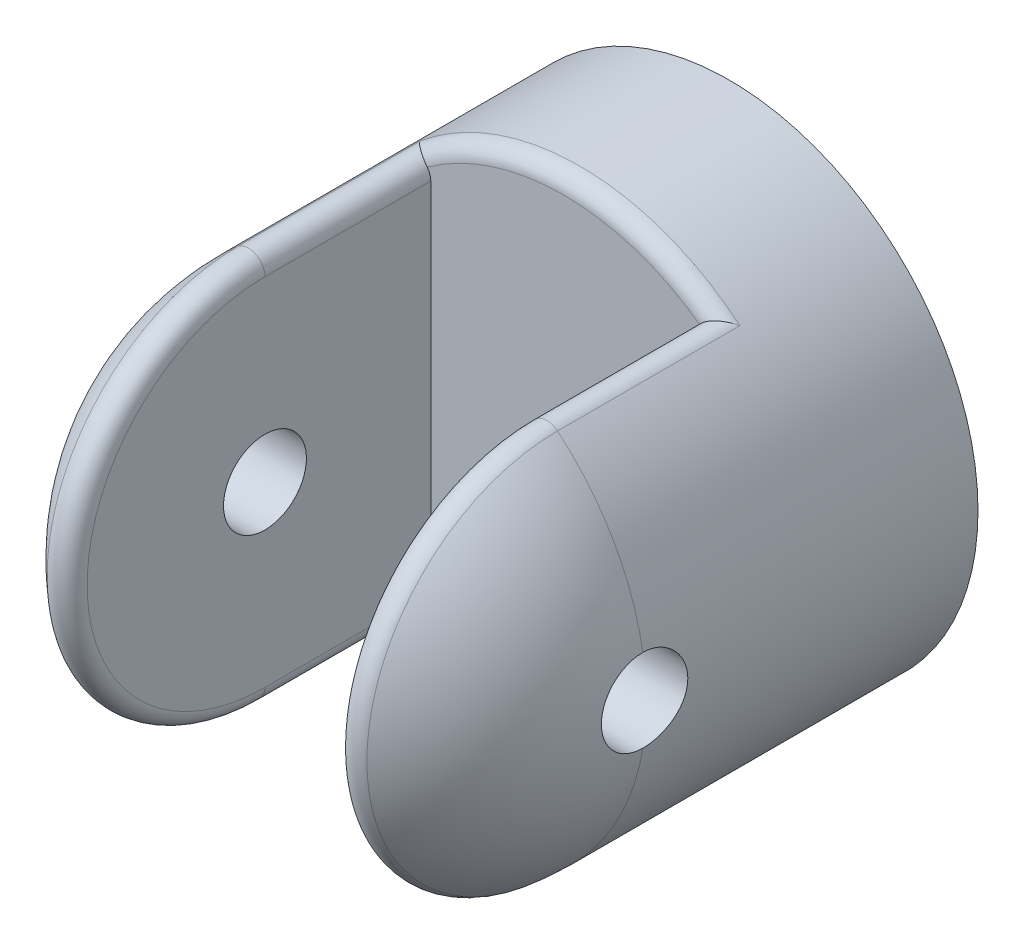
ISO-10303-21;
HEADER;
FILE_DESCRIPTION(('STEP AP214'),'2;1');
FILE_NAME('part.step','',(''),(''),'','','');
FILE_SCHEMA(('AUTOMOTIVE_DESIGN { 1 0 10303 214 1 1 1 1 }'));
ENDSEC;
DATA;
#1=APPLICATION_CONTEXT('core data for automotive mechanical design processes');
#2=APPLICATION_PROTOCOL_DEFINITION('international standard','automotive_design',2000,#1);
#3=PRODUCT_CONTEXT('',#1,'mechanical');
#4=PRODUCT('Part','Part','',(#3));
#5=PRODUCT_RELATED_PRODUCT_CATEGORY('part','',(#4));
#6=PRODUCT_DEFINITION_FORMATION('','',#4);
#7=PRODUCT_DEFINITION_CONTEXT('part definition',#1,'design');
#8=PRODUCT_DEFINITION('design','',#6,#7);
#9=PRODUCT_DEFINITION_SHAPE('','',#8);
#10=(LENGTH_UNIT() NAMED_UNIT(*) SI_UNIT(.MILLI.,.METRE.));
#11=(NAMED_UNIT(*) PLANE_ANGLE_UNIT() SI_UNIT($,.RADIAN.));
#12=(NAMED_UNIT(*) SI_UNIT($,.STERADIAN.) SOLID_ANGLE_UNIT());
#13=UNCERTAINTY_MEASURE_WITH_UNIT(LENGTH_MEASURE(1.E-05),#10,'distance_accuracy_value','');
#14=(GEOMETRIC_REPRESENTATION_CONTEXT(3) GLOBAL_UNCERTAINTY_ASSIGNED_CONTEXT((#13)) GLOBAL_UNIT_ASSIGNED_CONTEXT((#10,
#11,#12)) REPRESENTATION_CONTEXT('',''));
#15=CARTESIAN_POINT('',(0.,0.,0.));
#16=DIRECTION('',(0.,0.,1.));
#17=DIRECTION('',(1.,0.,0.));
#18=AXIS2_PLACEMENT_3D('',#15,#16,#17);
#19=CARTESIAN_POINT('',(0.,0.,10.));
#20=DIRECTION('',(0.,0.,1.));
#21=DIRECTION('',(1.,0.,0.));
#22=AXIS2_PLACEMENT_3D('',#19,#20,#21);
#23=SPHERICAL_SURFACE('',#22,7.5);
#24=CARTESIAN_POINT('',(0.,0.,10.));
#25=DIRECTION('',(0.,0.,1.));
#26=DIRECTION('',(1.,0.,0.));
#27=AXIS2_PLACEMENT_3D('',#24,#25,#26);
#28=CIRCLE('',#27,7.5);
#29=CARTESIAN_POINT('',(7.39509972887452,1.25,10.));
#30=VERTEX_POINT('',#29);
#31=CARTESIAN_POINT('',(4.82142857142857,5.74489569362336,10.));
#32=VERTEX_POINT('',#31);
#33=EDGE_CURVE('E378',#30,#32,#28,.T.);
#34=ORIENTED_EDGE('',*,*,#33,.T.);
#35=CARTESIAN_POINT('',(4.82142857142857,0.,10.));
#36=DIRECTION('',(-1.,0.,0.));
#37=DIRECTION('',(0.,0.,1.));
#38=AXIS2_PLACEMENT_3D('',#35,#36,#37);
#39=CIRCLE('',#38,5.74489569362336);
#40=CARTESIAN_POINT('',(4.82142857142857,-5.74489569362336,10.));
#41=VERTEX_POINT('',#40);
#42=EDGE_CURVE('E335',#32,#41,#39,.F.);
#43=ORIENTED_EDGE('',*,*,#42,.T.);
#44=CARTESIAN_POINT('',(7.39509972887452,-1.25,10.));
#45=VERTEX_POINT('',#44);
#46=EDGE_CURVE('E158',#41,#45,#28,.T.);
#47=ORIENTED_EDGE('',*,*,#46,.T.);
#48=CARTESIAN_POINT('',(7.39509972887452,0.,10.));
#49=DIRECTION('',(-1.,0.,0.));
#50=DIRECTION('',(0.,0.,1.));
#51=AXIS2_PLACEMENT_3D('',#48,#49,#50);
#52=CIRCLE('',#51,1.25);
#53=EDGE_CURVE('E173',#30,#45,#52,.F.);
#54=ORIENTED_EDGE('',*,*,#53,.F.);
#55=EDGE_LOOP('',(#34,#43,#47,#54));
#56=FACE_BOUND('',#55,.T.);
#57=ADVANCED_FACE('F45',(#56),#23,.T.);
#58=CARTESIAN_POINT('',(0.,0.,10.));
#59=DIRECTION('',(0.,0.,-1.));
#60=DIRECTION('',(-1.,0.,0.));
#61=AXIS2_PLACEMENT_3D('',#58,#59,#60);
#62=CYLINDRICAL_SURFACE('',#61,7.5);
#63=ORIENTED_EDGE('',*,*,#46,.F.);
#64=DIRECTION('',(0.,0.,-1.));
#65=VECTOR('',#64,1.);
#66=CARTESIAN_POINT('',(4.82142857142857,-5.74489569362336,10.));
#67=LINE('',#66,#65);
#68=CARTESIAN_POINT('',(4.82142857142857,-5.74489569362336,4.5));
#69=VERTEX_POINT('',#68);
#70=EDGE_CURVE('E306',#41,#69,#67,.T.);
#71=ORIENTED_EDGE('',*,*,#70,.T.);
#72=CARTESIAN_POINT('',(0.,0.,4.5));
#73=DIRECTION('',(0.,0.,-1.));
#74=DIRECTION('',(-1.,0.,0.));
#75=AXIS2_PLACEMENT_3D('',#72,#73,#74);
#76=CIRCLE('',#75,7.5);
#77=CARTESIAN_POINT('',(-4.82142857142857,-5.74489569362336,4.5));
#78=VERTEX_POINT('',#77);
#79=EDGE_CURVE('E300',#69,#78,#76,.T.);
#80=ORIENTED_EDGE('',*,*,#79,.T.);
#81=DIRECTION('',(0.,0.,-1.));
#82=VECTOR('',#81,1.);
#83=CARTESIAN_POINT('',(-4.82142857142857,-5.74489569362336,10.));
#84=LINE('',#83,#82);
#85=CARTESIAN_POINT('',(-4.82142857142857,-5.74489569362336,10.));
#86=VERTEX_POINT('',#85);
#87=EDGE_CURVE('E303',#78,#86,#84,.F.);
#88=ORIENTED_EDGE('',*,*,#87,.T.);
#89=CARTESIAN_POINT('',(-7.39509972887452,-1.25,10.));
#90=VERTEX_POINT('',#89);
#91=EDGE_CURVE('E156',#90,#86,#28,.T.);
#92=ORIENTED_EDGE('',*,*,#91,.F.);
#93=CARTESIAN_POINT('',(-7.39509972887452,-1.25,10.));
#94=CARTESIAN_POINT('',(-7.39509827179246,-1.25000005753556,9.9650928110527));
#95=CARTESIAN_POINT('',(-7.39534720302963,-1.24853686173687,9.93020258818633));
#96=CARTESIAN_POINT('',(-7.39633057516738,-1.24270148667581,9.8606766543903));
#97=CARTESIAN_POINT('',(-7.39706496747142,-1.23832959858466,9.82604091833637));
#98=CARTESIAN_POINT('',(-7.39996932723355,-1.22090187514942,9.72298440741557));
#99=CARTESIAN_POINT('',(-7.40284060734476,-1.20353380373658,9.65526161747966));
#100=CARTESIAN_POINT('',(-7.41012765096964,-1.15781567804882,9.52374591705141));
#101=CARTESIAN_POINT('',(-7.41454375371269,-1.12946321155092,9.45995387333777));
#102=CARTESIAN_POINT('',(-7.42442071847954,-1.06259823670043,9.3380200840865));
#103=CARTESIAN_POINT('',(-7.42988159409678,-1.02408559615255,9.27987841208005));
#104=CARTESIAN_POINT('',(-7.44129207448233,-0.937595765443695,9.17034527555092));
#105=CARTESIAN_POINT('',(-7.44724552254956,-0.889539043971666,9.1190170310419));
#106=CARTESIAN_POINT('',(-7.45893686547244,-0.785491288126569,9.02510759959541));
#107=CARTESIAN_POINT('',(-7.46467472717335,-0.729499039626907,8.98252775359956));
#108=CARTESIAN_POINT('',(-7.47532883659593,-0.610759731508663,8.90709157117773));
#109=CARTESIAN_POINT('',(-7.48023999155071,-0.547974455988943,8.87429460889678));
#110=CARTESIAN_POINT('',(-7.48864388495465,-0.417693962545651,8.8197382391933));
#111=CARTESIAN_POINT('',(-7.4921367962019,-0.350199319583999,8.797977487044));
#112=CARTESIAN_POINT('',(-7.49728364289362,-0.213072677091856,8.76630391627188));
#113=CARTESIAN_POINT('',(-7.4989542261109,-0.143466101292598,8.7562837782925));
#114=CARTESIAN_POINT('',(-7.50032540350412,-0.00353931626425419,8.74804208287004));
#115=CARTESIAN_POINT('',(-7.5000260848567,0.066780861247375,8.74982000331215));
#116=CARTESIAN_POINT('',(-7.49750428817693,0.205401314212721,8.7650406982694));
#117=CARTESIAN_POINT('',(-7.49530090418738,0.273714702876332,8.77836766224837));
#118=CARTESIAN_POINT('',(-7.48923986934197,0.407121405942324,8.81612569819478));
#119=CARTESIAN_POINT('',(-7.48538217865082,0.472214642762168,8.84055703755359));
#120=CARTESIAN_POINT('',(-7.47641340862498,0.597679243262454,8.89994585524146));
#121=CARTESIAN_POINT('',(-7.47129664500616,0.658027507533283,8.9349512395924));
#122=CARTESIAN_POINT('',(-7.46037847450187,0.772034773839589,9.01445814513424));
#123=CARTESIAN_POINT('',(-7.45457703766278,0.825693483003876,9.05896008185658));
#124=CARTESIAN_POINT('',(-7.44285215208957,0.925478700891914,9.15683234077759));
#125=CARTESIAN_POINT('',(-7.43692807481795,0.971506995164296,9.21030276480427));
#126=CARTESIAN_POINT('',(-7.42569127924361,1.05396725542932,9.32427782091681));
#127=CARTESIAN_POINT('',(-7.42037873548972,1.09039648538552,9.38478445147583));
#128=CARTESIAN_POINT('',(-7.4109654061728,1.15264407783289,9.51123680928091));
#129=CARTESIAN_POINT('',(-7.40686668300677,1.17844440956436,9.57719155303115));
#130=CARTESIAN_POINT('',(-7.40037766821894,1.21853592013065,9.71253713391149));
#131=CARTESIAN_POINT('',(-7.39798482294086,1.23284430620161,9.78192266800822));
#132=CARTESIAN_POINT('',(-7.39608901108542,1.24413493023176,9.87652989836086));
#133=CARTESIAN_POINT('',(-7.39571836173485,1.24633524900243,9.90119299018772));
#134=CARTESIAN_POINT('',(-7.39522397012045,1.2492658698301,9.95056712545258));
#135=CARTESIAN_POINT('',(-7.39509981262618,1.24999864407297,9.97527801793764));
#136=CARTESIAN_POINT('',(-7.39509972887452,1.25,10.));
#137=B_SPLINE_CURVE_WITH_KNOTS('',3,(#93,#94,#95,#96,#97,#98,#99,#100,#101,#102,#103,#104,#105,
#106,#107,#108,#109,#110,#111,#112,#113,#114,#115,#116,#117,#118,#119,#120,#121,#122,#123,#124,
#125,#126,#127,#128,#129,#130,#131,#132,#133,#134,#135,#136),.UNSPECIFIED.,.F.,.F.,(4,2,2,2,2,2,
2,2,2,2,2,2,2,2,2,2,2,2,2,2,2,4),(0.,0.104656466266306,0.209302457596598,0.418142199152871,
0.62702782888384,0.835916176586109,1.0466243411297,1.25736477865483,1.46935936547955,
1.68132811523487,1.8913437860973,2.10135016292487,2.30927470838211,2.51720426089053,
2.72609034484371,2.93498557069755,3.14638993574912,3.35785449269842,3.56967631340514,
3.78118037252096,3.85543821232553,3.92957085380307),.UNSPECIFIED.);
#138=CARTESIAN_POINT('',(-7.39509972887452,1.25,10.));
#139=VERTEX_POINT('',#138);
#140=EDGE_CURVE('E161',#90,#139,#137,.T.);
#141=ORIENTED_EDGE('',*,*,#140,.T.);
#142=CARTESIAN_POINT('',(-4.82142857142857,5.74489569362336,10.));
#143=VERTEX_POINT('',#142);
#144=EDGE_CURVE('E143',#143,#139,#28,.T.);
#145=ORIENTED_EDGE('',*,*,#144,.F.);
#146=DIRECTION('',(0.,0.,-1.));
#147=VECTOR('',#146,1.);
#148=CARTESIAN_POINT('',(-4.82142857142857,5.74489569362336,10.));
#149=LINE('',#148,#147);
#150=CARTESIAN_POINT('',(-4.82142857142857,5.74489569362336,4.5));
#151=VERTEX_POINT('',#150);
#152=EDGE_CURVE('E155',#143,#151,#149,.T.);
#153=ORIENTED_EDGE('',*,*,#152,.T.);
#154=CARTESIAN_POINT('',(0.,0.,4.5));
#155=DIRECTION('',(0.,0.,-1.));
#156=DIRECTION('',(-1.,0.,0.));
#157=AXIS2_PLACEMENT_3D('',#154,#155,#156);
#158=CIRCLE('',#157,7.5);
#159=CARTESIAN_POINT('',(4.82142857142857,5.74489569362336,4.5));
#160=VERTEX_POINT('',#159);
#161=EDGE_CURVE('E294',#151,#160,#158,.T.);
#162=ORIENTED_EDGE('',*,*,#161,.T.);
#163=DIRECTION('',(0.,0.,-1.));
#164=VECTOR('',#163,1.);
#165=CARTESIAN_POINT('',(4.82142857142857,5.74489569362336,10.));
#166=LINE('',#165,#164);
#167=EDGE_CURVE('E297',#160,#32,#166,.F.);
#168=ORIENTED_EDGE('',*,*,#167,.T.);
#169=ORIENTED_EDGE('',*,*,#33,.F.);
#170=CARTESIAN_POINT('',(7.39509972887452,1.25,10.));
#171=CARTESIAN_POINT('',(7.39509827179246,1.25000005753556,9.9650928110527));
#172=CARTESIAN_POINT('',(7.39534720302963,1.24853686173687,9.93020258818633));
#173=CARTESIAN_POINT('',(7.39633057516738,1.24270148667581,9.8606766543903));
#174=CARTESIAN_POINT('',(7.39706496747142,1.23832959858466,9.82604091833637));
#175=CARTESIAN_POINT('',(7.39996932723355,1.22090187514942,9.72298440741557));
#176=CARTESIAN_POINT('',(7.40284060734476,1.20353380373658,9.65526161747966));
#177=CARTESIAN_POINT('',(7.41012765096964,1.15781567804882,9.52374591705141));
#178=CARTESIAN_POINT('',(7.41454375371269,1.12946321155092,9.45995387333777));
#179=CARTESIAN_POINT('',(7.42442071847954,1.06259823670043,9.3380200840865));
#180=CARTESIAN_POINT('',(7.42988159409678,1.02408559615255,9.27987841208005));
#181=CARTESIAN_POINT('',(7.44129207448233,0.937595765443695,9.17034527555092));
#182=CARTESIAN_POINT('',(7.44724552254956,0.889539043971666,9.1190170310419));
#183=CARTESIAN_POINT('',(7.45893686547244,0.785491288126569,9.02510759959541));
#184=CARTESIAN_POINT('',(7.46467472717335,0.729499039626907,8.98252775359956));
#185=CARTESIAN_POINT('',(7.47532883659593,0.610759731508663,8.90709157117773));
#186=CARTESIAN_POINT('',(7.48023999155071,0.547974455988943,8.87429460889678));
#187=CARTESIAN_POINT('',(7.48864388495465,0.417693962545651,8.8197382391933));
#188=CARTESIAN_POINT('',(7.4921367962019,0.350199319583999,8.797977487044));
#189=CARTESIAN_POINT('',(7.49728364289362,0.213072677091856,8.76630391627188));
#190=CARTESIAN_POINT('',(7.4989542261109,0.143466101292598,8.7562837782925));
#191=CARTESIAN_POINT('',(7.50032540350412,0.00353931626425419,8.74804208287004));
#192=CARTESIAN_POINT('',(7.5000260848567,-0.066780861247375,8.74982000331215));
#193=CARTESIAN_POINT('',(7.49750428817693,-0.205401314212721,8.7650406982694));
#194=CARTESIAN_POINT('',(7.49530090418738,-0.273714702876332,8.77836766224837));
#195=CARTESIAN_POINT('',(7.48923986934197,-0.407121405942324,8.81612569819478));
#196=CARTESIAN_POINT('',(7.48538217865082,-0.472214642762168,8.84055703755359));
#197=CARTESIAN_POINT('',(7.47641340862498,-0.597679243262454,8.89994585524146));
#198=CARTESIAN_POINT('',(7.47129664500616,-0.658027507533283,8.9349512395924));
#199=CARTESIAN_POINT('',(7.46037847450187,-0.772034773839589,9.01445814513424));
#200=CARTESIAN_POINT('',(7.45457703766278,-0.825693483003876,9.05896008185658));
#201=CARTESIAN_POINT('',(7.44285215208957,-0.925478700891914,9.15683234077759));
#202=CARTESIAN_POINT('',(7.43692807481795,-0.971506995164296,9.21030276480427));
#203=CARTESIAN_POINT('',(7.42569127924361,-1.05396725542932,9.32427782091681));
#204=CARTESIAN_POINT('',(7.42037873548972,-1.09039648538552,9.38478445147583));
#205=CARTESIAN_POINT('',(7.4109654061728,-1.15264407783289,9.51123680928091));
#206=CARTESIAN_POINT('',(7.40686668300677,-1.17844440956436,9.57719155303115));
#207=CARTESIAN_POINT('',(7.40037766821894,-1.21853592013065,9.71253713391149));
#208=CARTESIAN_POINT('',(7.39798482294086,-1.23284430620161,9.78192266800822));
#209=CARTESIAN_POINT('',(7.39608901108542,-1.24413493023176,9.87652989836086));
#210=CARTESIAN_POINT('',(7.39571836173485,-1.24633524900243,9.90119299018772));
#211=CARTESIAN_POINT('',(7.39522397012045,-1.2492658698301,9.95056712545258));
#212=CARTESIAN_POINT('',(7.39509981262618,-1.24999864407297,9.97527801793764));
#213=CARTESIAN_POINT('',(7.39509972887452,-1.25,10.));
#214=B_SPLINE_CURVE_WITH_KNOTS('',3,(#170,#171,#172,#173,#174,#175,#176,#177,#178,#179,#180,
#181,#182,#183,#184,#185,#186,#187,#188,#189,#190,#191,#192,#193,#194,#195,#196,#197,#198,#199,
#200,#201,#202,#203,#204,#205,#206,#207,#208,#209,#210,#211,#212,#213),.UNSPECIFIED.,.F.,.F.,(4,
2,2,2,2,2,2,2,2,2,2,2,2,2,2,2,2,2,2,2,2,4),(0.,0.104656466266306,0.209302457596598,
0.418142199152871,0.62702782888384,0.835916176586109,1.0466243411297,1.25736477865483,
1.46935936547955,1.68132811523487,1.8913437860973,2.10135016292487,2.30927470838211,
2.51720426089053,2.72609034484371,2.93498557069755,3.14638993574912,3.35785449269842,
3.56967631340514,3.78118037252096,3.85543821232553,3.92957085380307),.UNSPECIFIED.);
#215=EDGE_CURVE('E169',#30,#45,#214,.T.);
#216=ORIENTED_EDGE('',*,*,#215,.T.);
#217=EDGE_LOOP('',(#63,#71,#80,#88,#92,#141,#145,#153,#162,#168,#169,#216));
#218=FACE_BOUND('',#217,.T.);
#219=CARTESIAN_POINT('',(0.,0.,0.));
#220=DIRECTION('',(0.,0.,1.));
#221=DIRECTION('',(1.,0.,0.));
#222=AXIS2_PLACEMENT_3D('',#219,#220,#221);
#223=CIRCLE('',#222,7.5);
#224=CARTESIAN_POINT('',(7.5,0.,0.));
#225=VERTEX_POINT('',#224);
#226=EDGE_CURVE('E380',#225,#225,#223,.T.);
#227=ORIENTED_EDGE('',*,*,#226,.T.);
#228=EDGE_LOOP('',(#227));
#229=FACE_BOUND('',#228,.T.);
#230=ADVANCED_FACE('F166',(#218,#229),#62,.T.);
#231=ORIENTED_EDGE('',*,*,#91,.T.);
#232=CARTESIAN_POINT('',(-4.82142857142857,0.,10.));
#233=DIRECTION('',(1.,0.,0.));
#234=DIRECTION('',(0.,0.,-1.));
#235=AXIS2_PLACEMENT_3D('',#232,#233,#234);
#236=CIRCLE('',#235,5.74489569362336);
#237=EDGE_CURVE('E150',#86,#143,#236,.F.);
#238=ORIENTED_EDGE('',*,*,#237,.T.);
#239=ORIENTED_EDGE('',*,*,#144,.T.);
#240=CARTESIAN_POINT('',(-7.39509972887452,0.,10.));
#241=DIRECTION('',(1.,0.,0.));
#242=DIRECTION('',(0.,0.,-1.));
#243=AXIS2_PLACEMENT_3D('',#240,#241,#242);
#244=CIRCLE('',#243,1.25);
#245=EDGE_CURVE('E147',#90,#139,#244,.F.);
#246=ORIENTED_EDGE('',*,*,#245,.F.);
#247=EDGE_LOOP('',(#231,#238,#239,#246));
#248=FACE_BOUND('',#247,.T.);
#249=ADVANCED_FACE('F146',(#248),#23,.T.);
#250=CARTESIAN_POINT('',(0.,0.,0.));
#251=DIRECTION('',(0.,0.,1.));
#252=DIRECTION('',(1.,0.,0.));
#253=AXIS2_PLACEMENT_3D('',#250,#251,#252);
#254=PLANE('',#253);
#255=ORIENTED_EDGE('',*,*,#226,.F.);
#256=EDGE_LOOP('',(#255));
#257=FACE_BOUND('',#256,.T.);
#258=ADVANCED_FACE('F201',(#257),#254,.F.);
#259=CARTESIAN_POINT('',(-4.,-19.,5.));
#260=DIRECTION('',(0.,0.,-1.));
#261=DIRECTION('',(-1.,0.,0.));
#262=AXIS2_PLACEMENT_3D('',#259,#260,#261);
#263=PLANE('',#262);
#264=CARTESIAN_POINT('',(-4.5,-5.3619026473818,5.));
#265=DIRECTION('',(0.,0.,-1.));
#266=DIRECTION('',(-1.,0.,0.));
#267=AXIS2_PLACEMENT_3D('',#264,#265,#266);
#268=CIRCLE('',#267,0.5);
#269=CARTESIAN_POINT('',(-4.,-5.3619026473818,5.));
#270=VERTEX_POINT('',#269);
#271=CARTESIAN_POINT('',(-4.10577169562848,-5.66944783760977,5.));
#272=VERTEX_POINT('',#271);
#273=EDGE_CURVE('E61',#270,#272,#268,.T.);
#274=ORIENTED_EDGE('',*,*,#273,.T.);
#275=CARTESIAN_POINT('',(0.,0.,5.));
#276=DIRECTION('',(0.,0.,-1.));
#277=DIRECTION('',(-1.,0.,0.));
#278=AXIS2_PLACEMENT_3D('',#275,#276,#277);
#279=CIRCLE('',#278,7.);
#280=CARTESIAN_POINT('',(4.10577169562848,-5.66944783760977,5.));
#281=VERTEX_POINT('',#280);
#282=EDGE_CURVE('E76',#272,#281,#279,.F.);
#283=ORIENTED_EDGE('',*,*,#282,.T.);
#284=CARTESIAN_POINT('',(4.5,-5.3619026473818,5.));
#285=DIRECTION('',(0.,0.,-1.));
#286=DIRECTION('',(-1.,0.,0.));
#287=AXIS2_PLACEMENT_3D('',#284,#285,#286);
#288=CIRCLE('',#287,0.5);
#289=CARTESIAN_POINT('',(4.,-5.3619026473818,5.));
#290=VERTEX_POINT('',#289);
#291=EDGE_CURVE('E338',#281,#290,#288,.T.);
#292=ORIENTED_EDGE('',*,*,#291,.T.);
#293=DIRECTION('',(0.,1.,0.));
#294=VECTOR('',#293,1.);
#295=CARTESIAN_POINT('',(4.,-19.,5.));
#296=LINE('',#295,#294);
#297=CARTESIAN_POINT('',(4.,5.3619026473818,5.));
#298=VERTEX_POINT('',#297);
#299=EDGE_CURVE('E386',#290,#298,#296,.T.);
#300=ORIENTED_EDGE('',*,*,#299,.T.);
#301=CARTESIAN_POINT('',(4.5,5.3619026473818,5.));
#302=DIRECTION('',(0.,0.,-1.));
#303=DIRECTION('',(-1.,0.,0.));
#304=AXIS2_PLACEMENT_3D('',#301,#302,#303);
#305=CIRCLE('',#304,0.5);
#306=CARTESIAN_POINT('',(4.10577169562848,5.66944783760977,5.));
#307=VERTEX_POINT('',#306);
#308=EDGE_CURVE('E341',#298,#307,#305,.T.);
#309=ORIENTED_EDGE('',*,*,#308,.T.);
#310=CARTESIAN_POINT('',(0.,0.,5.));
#311=DIRECTION('',(0.,0.,-1.));
#312=DIRECTION('',(-1.,0.,0.));
#313=AXIS2_PLACEMENT_3D('',#310,#311,#312);
#314=CIRCLE('',#313,7.);
#315=CARTESIAN_POINT('',(-4.10577169562848,5.66944783760977,5.));
#316=VERTEX_POINT('',#315);
#317=EDGE_CURVE('E68',#307,#316,#314,.F.);
#318=ORIENTED_EDGE('',*,*,#317,.T.);
#319=CARTESIAN_POINT('',(-4.5,5.3619026473818,5.));
#320=DIRECTION('',(0.,0.,-1.));
#321=DIRECTION('',(-1.,0.,0.));
#322=AXIS2_PLACEMENT_3D('',#319,#320,#321);
#323=CIRCLE('',#322,0.5);
#324=CARTESIAN_POINT('',(-4.,5.3619026473818,5.));
#325=VERTEX_POINT('',#324);
#326=EDGE_CURVE('E11',#316,#325,#323,.T.);
#327=ORIENTED_EDGE('',*,*,#326,.T.);
#328=DIRECTION('',(0.,1.,0.));
#329=VECTOR('',#328,1.);
#330=CARTESIAN_POINT('',(-4.,-19.,5.));
#331=LINE('',#330,#329);
#332=EDGE_CURVE('E349',#270,#325,#331,.T.);
#333=ORIENTED_EDGE('',*,*,#332,.F.);
#334=EDGE_LOOP('',(#274,#283,#292,#300,#309,#318,#327,#333));
#335=FACE_BOUND('',#334,.T.);
#336=ADVANCED_FACE('F196',(#335),#263,.F.);
#337=CARTESIAN_POINT('',(4.,-19.,9.5));
#338=DIRECTION('',(1.,0.,0.));
#339=DIRECTION('',(0.,0.,-1.));
#340=AXIS2_PLACEMENT_3D('',#337,#338,#339);
#341=PLANE('',#340);
#342=ORIENTED_EDGE('',*,*,#299,.F.);
#343=DIRECTION('',(0.,0.,-1.));
#344=VECTOR('',#343,1.);
#345=CARTESIAN_POINT('',(4.,-5.3619026473818,9.5));
#346=LINE('',#345,#344);
#347=CARTESIAN_POINT('',(4.,-5.3619026473818,10.));
#348=VERTEX_POINT('',#347);
#349=EDGE_CURVE('E316',#290,#348,#346,.F.);
#350=ORIENTED_EDGE('',*,*,#349,.T.);
#351=CARTESIAN_POINT('',(4.,0.,10.));
#352=DIRECTION('',(1.,0.,0.));
#353=DIRECTION('',(0.,0.,-1.));
#354=AXIS2_PLACEMENT_3D('',#351,#352,#353);
#355=CIRCLE('',#354,5.3619026473818);
#356=CARTESIAN_POINT('',(4.,5.3619026473818,10.));
#357=VERTEX_POINT('',#356);
#358=EDGE_CURVE('E310',#348,#357,#355,.F.);
#359=ORIENTED_EDGE('',*,*,#358,.T.);
#360=DIRECTION('',(0.,0.,-1.));
#361=VECTOR('',#360,1.);
#362=CARTESIAN_POINT('',(4.,5.3619026473818,9.5));
#363=LINE('',#362,#361);
#364=EDGE_CURVE('E313',#357,#298,#363,.T.);
#365=ORIENTED_EDGE('',*,*,#364,.T.);
#366=EDGE_LOOP('',(#342,#350,#359,#365));
#367=FACE_BOUND('',#366,.T.);
#368=CARTESIAN_POINT('',(4.,0.,10.));
#369=DIRECTION('',(1.,0.,0.));
#370=DIRECTION('',(0.,0.,-1.));
#371=AXIS2_PLACEMENT_3D('',#368,#369,#370);
#372=CIRCLE('',#371,1.25);
#373=CARTESIAN_POINT('',(4.,0.,8.75));
#374=VERTEX_POINT('',#373);
#375=EDGE_CURVE('E163',#374,#374,#372,.T.);
#376=ORIENTED_EDGE('',*,*,#375,.T.);
#377=EDGE_LOOP('',(#376));
#378=FACE_BOUND('',#377,.T.);
#379=ADVANCED_FACE('F200',(#367,#378),#341,.F.);
#380=CARTESIAN_POINT('',(-4.,-19.,10.));
#381=DIRECTION('',(-1.,0.,0.));
#382=DIRECTION('',(0.,0.,1.));
#383=AXIS2_PLACEMENT_3D('',#380,#381,#382);
#384=PLANE('',#383);
#385=CARTESIAN_POINT('',(-4.,0.,10.));
#386=DIRECTION('',(-1.,0.,0.));
#387=DIRECTION('',(0.,0.,1.));
#388=AXIS2_PLACEMENT_3D('',#385,#386,#387);
#389=CIRCLE('',#388,1.25);
#390=CARTESIAN_POINT('',(-4.,0.,11.25));
#391=VERTEX_POINT('',#390);
#392=EDGE_CURVE('E280',#391,#391,#389,.T.);
#393=ORIENTED_EDGE('',*,*,#392,.T.);
#394=EDGE_LOOP('',(#393));
#395=FACE_BOUND('',#394,.T.);
#396=CARTESIAN_POINT('',(-4.,0.,10.));
#397=DIRECTION('',(-1.,0.,0.));
#398=DIRECTION('',(0.,0.,1.));
#399=AXIS2_PLACEMENT_3D('',#396,#397,#398);
#400=CIRCLE('',#399,5.3619026473818);
#401=CARTESIAN_POINT('',(-4.,5.3619026473818,10.));
#402=VERTEX_POINT('',#401);
#403=CARTESIAN_POINT('',(-4.,-5.3619026473818,10.));
#404=VERTEX_POINT('',#403);
#405=EDGE_CURVE('E323',#402,#404,#400,.F.);
#406=ORIENTED_EDGE('',*,*,#405,.T.);
#407=DIRECTION('',(0.,0.,-1.));
#408=VECTOR('',#407,1.);
#409=CARTESIAN_POINT('',(-4.,-5.3619026473818,10.));
#410=LINE('',#409,#408);
#411=EDGE_CURVE('E326',#404,#270,#410,.T.);
#412=ORIENTED_EDGE('',*,*,#411,.T.);
#413=ORIENTED_EDGE('',*,*,#332,.T.);
#414=DIRECTION('',(0.,0.,-1.));
#415=VECTOR('',#414,1.);
#416=CARTESIAN_POINT('',(-4.,5.3619026473818,10.));
#417=LINE('',#416,#415);
#418=EDGE_CURVE('E320',#325,#402,#417,.F.);
#419=ORIENTED_EDGE('',*,*,#418,.T.);
#420=EDGE_LOOP('',(#406,#412,#413,#419));
#421=FACE_BOUND('',#420,.T.);
#422=ADVANCED_FACE('F194',(#395,#421),#384,.F.);
#423=CARTESIAN_POINT('',(-19.,0.,10.));
#424=DIRECTION('',(1.,0.,0.));
#425=DIRECTION('',(0.,0.,-1.));
#426=AXIS2_PLACEMENT_3D('',#423,#424,#425);
#427=CYLINDRICAL_SURFACE('',#426,1.25);
#428=ORIENTED_EDGE('',*,*,#392,.F.);
#429=EDGE_LOOP('',(#428));
#430=FACE_BOUND('',#429,.T.);
#431=ORIENTED_EDGE('',*,*,#245,.T.);
#432=ORIENTED_EDGE('',*,*,#140,.F.);
#433=EDGE_LOOP('',(#431,#432));
#434=FACE_BOUND('',#433,.T.);
#435=ADVANCED_FACE('F160',(#430,#434),#427,.F.);
#436=ORIENTED_EDGE('',*,*,#53,.T.);
#437=ORIENTED_EDGE('',*,*,#215,.F.);
#438=EDGE_LOOP('',(#436,#437));
#439=FACE_BOUND('',#438,.T.);
#440=ORIENTED_EDGE('',*,*,#375,.F.);
#441=EDGE_LOOP('',(#440));
#442=FACE_BOUND('',#441,.T.);
#443=ADVANCED_FACE('F193',(#439,#442),#427,.F.);
#444=CARTESIAN_POINT('',(-4.5,5.3619026473818,10.));
#445=DIRECTION('',(0.,0.,-1.));
#446=DIRECTION('',(-1.,0.,0.));
#447=AXIS2_PLACEMENT_3D('',#444,#445,#446);
#448=CYLINDRICAL_SURFACE('',#447,0.5);
#449=ORIENTED_EDGE('',*,*,#418,.F.);
#450=ORIENTED_EDGE('',*,*,#326,.F.);
#451=CARTESIAN_POINT('',(-4.10577169562848,5.66944783760977,5.));
#452=CARTESIAN_POINT('',(-4.119661903776,5.68731388254085,5.00003535227214));
#453=CARTESIAN_POINT('',(-4.13478199335128,5.70414137805357,4.99846793199711));
#454=CARTESIAN_POINT('',(-4.16670074633458,5.73525727758441,4.99249196224239));
#455=CARTESIAN_POINT('',(-4.18348358815651,5.74956658307036,4.98810835785598));
#456=CARTESIAN_POINT('',(-4.21815935906617,5.77546827858084,4.97687008712724));
#457=CARTESIAN_POINT('',(-4.23604878259789,5.78706874324045,4.97002292342635));
#458=CARTESIAN_POINT('',(-4.27247149887798,5.80762557374303,4.95428403946822));
#459=CARTESIAN_POINT('',(-4.2910062021158,5.81657568024738,4.9453875660063));
#460=CARTESIAN_POINT('',(-4.33583315753335,5.83503242420134,4.92201863140045));
#461=CARTESIAN_POINT('',(-4.36222257198922,5.84329227635379,4.90674814998822));
#462=CARTESIAN_POINT('',(-4.41458878793545,5.85528829489305,4.87391547047696));
#463=CARTESIAN_POINT('',(-4.44056478109659,5.85901647052598,4.85634928454718));
#464=CARTESIAN_POINT('',(-4.50070989120355,5.86310456745744,4.81306056312297));
#465=CARTESIAN_POINT('',(-4.53450324823681,5.86179265149161,4.78666081208492));
#466=CARTESIAN_POINT('',(-4.59971539751038,5.85296438757054,4.73205275786872));
#467=CARTESIAN_POINT('',(-4.63113109259798,5.84544009418895,4.70384218133997));
#468=CARTESIAN_POINT('',(-4.69039251556763,5.82526707268268,4.64707859410685));
#469=CARTESIAN_POINT('',(-4.71830556408485,5.81274496643499,4.61854983549287));
#470=CARTESIAN_POINT('',(-4.77101360482819,5.7831651150059,4.56107707877253));
#471=CARTESIAN_POINT('',(-4.79581521671192,5.7661172480243,4.53213411336249));
#472=CARTESIAN_POINT('',(-4.81972613125751,5.7463196470785,4.5021441867674));
#473=CARTESIAN_POINT('',(-4.82057855670768,5.74560906790061,4.50107206936992));
#474=CARTESIAN_POINT('',(-4.82142857142857,5.74489569362336,4.5));
#475=B_SPLINE_CURVE_WITH_KNOTS('',3,(#451,#452,#453,#454,#455,#456,#457,#458,#459,#460,#461,
#462,#463,#464,#465,#466,#467,#468,#469,#470,#471,#472,#473,#474),.UNSPECIFIED.,.F.,.F.,(4,2,2,
2,2,2,2,2,2,2,2,4),(0.,0.0676845841263272,0.134777749096304,0.201668291254784,0.268715571155792,
0.362958428476518,0.457367225287674,0.585389388734371,0.713575542415653,0.838701554799065,
0.963556673520436,0.968185787288805),.UNSPECIFIED.);
#476=EDGE_CURVE('E50',#151,#316,#475,.F.);
#477=ORIENTED_EDGE('',*,*,#476,.F.);
#478=ORIENTED_EDGE('',*,*,#152,.F.);
#479=CARTESIAN_POINT('',(-4.5,5.3619026473818,10.));
#480=DIRECTION('',(0.,0.,1.));
#481=DIRECTION('',(1.,0.,0.));
#482=AXIS2_PLACEMENT_3D('',#479,#480,#481);
#483=CIRCLE('',#482,0.5);
#484=EDGE_CURVE('E271',#402,#143,#483,.T.);
#485=ORIENTED_EDGE('',*,*,#484,.F.);
#486=EDGE_LOOP('',(#449,#450,#477,#478,#485));
#487=FACE_BOUND('',#486,.T.);
#488=ADVANCED_FACE('F47',(#487),#448,.T.);
#489=CARTESIAN_POINT('',(0.,0.,4.5));
#490=DIRECTION('',(0.,0.,-1.));
#491=DIRECTION('',(-1.,0.,0.));
#492=AXIS2_PLACEMENT_3D('',#489,#490,#491);
#493=TOROIDAL_SURFACE('',#492,7.,0.5);
#494=ORIENTED_EDGE('',*,*,#317,.F.);
#495=CARTESIAN_POINT('',(4.10577169562848,5.66944783760977,5.));
#496=CARTESIAN_POINT('',(4.119661903776,5.68731388254085,5.00003535227214));
#497=CARTESIAN_POINT('',(4.13478199335128,5.70414137805357,4.99846793199711));
#498=CARTESIAN_POINT('',(4.16670074633458,5.73525727758441,4.99249196224239));
#499=CARTESIAN_POINT('',(4.18348358815651,5.74956658307036,4.98810835785598));
#500=CARTESIAN_POINT('',(4.21815935906617,5.77546827858084,4.97687008712724));
#501=CARTESIAN_POINT('',(4.23604878259789,5.78706874324045,4.97002292342635));
#502=CARTESIAN_POINT('',(4.27247149887798,5.80762557374303,4.95428403946822));
#503=CARTESIAN_POINT('',(4.2910062021158,5.81657568024738,4.9453875660063));
#504=CARTESIAN_POINT('',(4.33583315753335,5.83503242420134,4.92201863140045));
#505=CARTESIAN_POINT('',(4.36222257198922,5.84329227635379,4.90674814998822));
#506=CARTESIAN_POINT('',(4.41458878793545,5.85528829489305,4.87391547047696));
#507=CARTESIAN_POINT('',(4.44056478109659,5.85901647052598,4.85634928454718));
#508=CARTESIAN_POINT('',(4.50070989120355,5.86310456745744,4.81306056312297));
#509=CARTESIAN_POINT('',(4.53450324823681,5.86179265149161,4.78666081208492));
#510=CARTESIAN_POINT('',(4.59971539751038,5.85296438757054,4.73205275786872));
#511=CARTESIAN_POINT('',(4.63113109259798,5.84544009418895,4.70384218133997));
#512=CARTESIAN_POINT('',(4.69039251556763,5.82526707268268,4.64707859410685));
#513=CARTESIAN_POINT('',(4.71830556408485,5.81274496643499,4.61854983549287));
#514=CARTESIAN_POINT('',(4.77101360482819,5.7831651150059,4.56107707877253));
#515=CARTESIAN_POINT('',(4.79581521671192,5.7661172480243,4.53213411336249));
#516=CARTESIAN_POINT('',(4.81972613125751,5.7463196470785,4.5021441867674));
#517=CARTESIAN_POINT('',(4.82057855670768,5.74560906790061,4.50107206936992));
#518=CARTESIAN_POINT('',(4.82142857142857,5.74489569362336,4.5));
#519=B_SPLINE_CURVE_WITH_KNOTS('',3,(#495,#496,#497,#498,#499,#500,#501,#502,#503,#504,#505,
#506,#507,#508,#509,#510,#511,#512,#513,#514,#515,#516,#517,#518),.UNSPECIFIED.,.F.,.F.,(4,2,2,
2,2,2,2,2,2,2,2,4),(0.,0.0676845841263272,0.134777749096304,0.201668291254784,0.268715571155792,
0.362958428476518,0.457367225287674,0.585389388734371,0.713575542415653,0.838701554799065,
0.963556673520436,0.968185787288805),.UNSPECIFIED.);
#520=EDGE_CURVE('E264',#160,#307,#519,.F.);
#521=ORIENTED_EDGE('',*,*,#520,.F.);
#522=ORIENTED_EDGE('',*,*,#161,.F.);
#523=ORIENTED_EDGE('',*,*,#476,.T.);
#524=EDGE_LOOP('',(#494,#521,#522,#523));
#525=FACE_BOUND('',#524,.T.);
#526=ADVANCED_FACE('F261',(#525),#493,.T.);
#527=CARTESIAN_POINT('',(-4.5,0.,10.));
#528=DIRECTION('',(-1.,0.,0.));
#529=DIRECTION('',(0.,0.,1.));
#530=AXIS2_PLACEMENT_3D('',#527,#528,#529);
#531=TOROIDAL_SURFACE('',#530,5.3619026473818,0.5);
#532=ORIENTED_EDGE('',*,*,#484,.T.);
#533=ORIENTED_EDGE('',*,*,#237,.F.);
#534=CARTESIAN_POINT('',(-4.5,-5.3619026473818,10.));
#535=DIRECTION('',(0.,0.,-1.));
#536=DIRECTION('',(-1.,0.,0.));
#537=AXIS2_PLACEMENT_3D('',#534,#535,#536);
#538=CIRCLE('',#537,0.5);
#539=EDGE_CURVE('E272',#404,#86,#538,.T.);
#540=ORIENTED_EDGE('',*,*,#539,.F.);
#541=ORIENTED_EDGE('',*,*,#405,.F.);
#542=EDGE_LOOP('',(#532,#533,#540,#541));
#543=FACE_BOUND('',#542,.T.);
#544=ADVANCED_FACE('F259',(#543),#531,.T.);
#545=CARTESIAN_POINT('',(4.5,5.3619026473818,10.));
#546=DIRECTION('',(0.,0.,-1.));
#547=DIRECTION('',(-1.,0.,0.));
#548=AXIS2_PLACEMENT_3D('',#545,#546,#547);
#549=CYLINDRICAL_SURFACE('',#548,0.5);
#550=ORIENTED_EDGE('',*,*,#308,.F.);
#551=ORIENTED_EDGE('',*,*,#364,.F.);
#552=CARTESIAN_POINT('',(4.5,5.3619026473818,10.));
#553=DIRECTION('',(0.,0.,1.));
#554=DIRECTION('',(1.,0.,0.));
#555=AXIS2_PLACEMENT_3D('',#552,#553,#554);
#556=CIRCLE('',#555,0.5);
#557=EDGE_CURVE('E245',#32,#357,#556,.T.);
#558=ORIENTED_EDGE('',*,*,#557,.F.);
#559=ORIENTED_EDGE('',*,*,#167,.F.);
#560=ORIENTED_EDGE('',*,*,#520,.T.);
#561=EDGE_LOOP('',(#550,#551,#558,#559,#560));
#562=FACE_BOUND('',#561,.T.);
#563=ADVANCED_FACE('F252',(#562),#549,.T.);
#564=CARTESIAN_POINT('',(-4.5,-5.3619026473818,10.));
#565=DIRECTION('',(0.,0.,-1.));
#566=DIRECTION('',(-1.,0.,0.));
#567=AXIS2_PLACEMENT_3D('',#564,#565,#566);
#568=CYLINDRICAL_SURFACE('',#567,0.5);
#569=ORIENTED_EDGE('',*,*,#539,.T.);
#570=ORIENTED_EDGE('',*,*,#87,.F.);
#571=CARTESIAN_POINT('',(-4.10577169562848,-5.66944783760977,5.));
#572=CARTESIAN_POINT('',(-4.119661903776,-5.68731388254085,5.00003535227214));
#573=CARTESIAN_POINT('',(-4.13478199335128,-5.70414137805356,4.99846793199711));
#574=CARTESIAN_POINT('',(-4.16670074633458,-5.73525727758441,4.99249196224239));
#575=CARTESIAN_POINT('',(-4.18348358815651,-5.74956658307036,4.98810835785598));
#576=CARTESIAN_POINT('',(-4.21815935906617,-5.77546827858084,4.97687008712724));
#577=CARTESIAN_POINT('',(-4.23604878259789,-5.78706874324045,4.97002292342635));
#578=CARTESIAN_POINT('',(-4.27247149887798,-5.80762557374303,4.95428403946822));
#579=CARTESIAN_POINT('',(-4.2910062021158,-5.81657568024738,4.9453875660063));
#580=CARTESIAN_POINT('',(-4.33583315753334,-5.83503242420134,4.92201863140045));
#581=CARTESIAN_POINT('',(-4.36222257198921,-5.84329227635379,4.90674814998822));
#582=CARTESIAN_POINT('',(-4.41458878793544,-5.85528829489305,4.87391547047696));
#583=CARTESIAN_POINT('',(-4.44056478109659,-5.85901647052598,4.85634928454718));
#584=CARTESIAN_POINT('',(-4.50070989120355,-5.86310456745744,4.81306056312298));
#585=CARTESIAN_POINT('',(-4.5345032482368,-5.86179265149161,4.78666081208492));
#586=CARTESIAN_POINT('',(-4.59971539751037,-5.85296438757054,4.73205275786872));
#587=CARTESIAN_POINT('',(-4.63113109259797,-5.84544009418895,4.70384218133998));
#588=CARTESIAN_POINT('',(-4.69039251556762,-5.82526707268268,4.64707859410686));
#589=CARTESIAN_POINT('',(-4.71830556408485,-5.812744966435,4.61854983549287));
#590=CARTESIAN_POINT('',(-4.77101360482819,-5.7831651150059,4.56107707877253));
#591=CARTESIAN_POINT('',(-4.79581521671192,-5.7661172480243,4.53213411336249));
#592=CARTESIAN_POINT('',(-4.81972613125751,-5.7463196470785,4.5021441867674));
#593=CARTESIAN_POINT('',(-4.82057855670768,-5.74560906790061,4.50107206936992));
#594=CARTESIAN_POINT('',(-4.82142857142857,-5.74489569362336,4.5));
#595=B_SPLINE_CURVE_WITH_KNOTS('',3,(#571,#572,#573,#574,#575,#576,#577,#578,#579,#580,#581,
#582,#583,#584,#585,#586,#587,#588,#589,#590,#591,#592,#593,#594),.UNSPECIFIED.,.F.,.F.,(4,2,2,
2,2,2,2,2,2,2,2,4),(0.,0.0676845841263272,0.134777749096303,0.201668291254782,0.26871557115579,
0.362958428476515,0.457367225287669,0.585389388734365,0.713575542415645,0.838701554799062,
0.963556673520437,0.968185787288806),.UNSPECIFIED.);
#596=EDGE_CURVE('E238',#272,#78,#595,.T.);
#597=ORIENTED_EDGE('',*,*,#596,.F.);
#598=ORIENTED_EDGE('',*,*,#273,.F.);
#599=ORIENTED_EDGE('',*,*,#411,.F.);
#600=EDGE_LOOP('',(#569,#570,#597,#598,#599));
#601=FACE_BOUND('',#600,.T.);
#602=ADVANCED_FACE('F248',(#601),#568,.T.);
#603=CARTESIAN_POINT('',(4.5,0.,10.));
#604=DIRECTION('',(1.,0.,0.));
#605=DIRECTION('',(0.,0.,-1.));
#606=AXIS2_PLACEMENT_3D('',#603,#604,#605);
#607=TOROIDAL_SURFACE('',#606,5.3619026473818,0.5);
#608=ORIENTED_EDGE('',*,*,#557,.T.);
#609=ORIENTED_EDGE('',*,*,#358,.F.);
#610=CARTESIAN_POINT('',(4.5,-5.3619026473818,10.));
#611=DIRECTION('',(0.,0.,-1.));
#612=DIRECTION('',(-1.,0.,0.));
#613=AXIS2_PLACEMENT_3D('',#610,#611,#612);
#614=CIRCLE('',#613,0.5);
#615=EDGE_CURVE('E246',#41,#348,#614,.T.);
#616=ORIENTED_EDGE('',*,*,#615,.F.);
#617=ORIENTED_EDGE('',*,*,#42,.F.);
#618=EDGE_LOOP('',(#608,#609,#616,#617));
#619=FACE_BOUND('',#618,.T.);
#620=ADVANCED_FACE('F226',(#619),#607,.T.);
#621=CARTESIAN_POINT('',(0.,0.,4.5));
#622=DIRECTION('',(0.,0.,-1.));
#623=DIRECTION('',(-1.,0.,0.));
#624=AXIS2_PLACEMENT_3D('',#621,#622,#623);
#625=TOROIDAL_SURFACE('',#624,7.,0.5);
#626=ORIENTED_EDGE('',*,*,#596,.T.);
#627=ORIENTED_EDGE('',*,*,#79,.F.);
#628=CARTESIAN_POINT('',(4.10577169562848,-5.66944783760977,5.));
#629=CARTESIAN_POINT('',(4.119661903776,-5.68731388254085,5.00003535227214));
#630=CARTESIAN_POINT('',(4.13478199335128,-5.70414137805357,4.99846793199711));
#631=CARTESIAN_POINT('',(4.16670074633458,-5.73525727758441,4.99249196224239));
#632=CARTESIAN_POINT('',(4.18348358815651,-5.74956658307036,4.98810835785598));
#633=CARTESIAN_POINT('',(4.21815935906617,-5.77546827858084,4.97687008712724));
#634=CARTESIAN_POINT('',(4.23604878259789,-5.78706874324045,4.97002292342635));
#635=CARTESIAN_POINT('',(4.27247149887798,-5.80762557374303,4.95428403946822));
#636=CARTESIAN_POINT('',(4.2910062021158,-5.81657568024738,4.9453875660063));
#637=CARTESIAN_POINT('',(4.33583315753335,-5.83503242420134,4.92201863140045));
#638=CARTESIAN_POINT('',(4.36222257198922,-5.84329227635379,4.90674814998822));
#639=CARTESIAN_POINT('',(4.41458878793545,-5.85528829489305,4.87391547047696));
#640=CARTESIAN_POINT('',(4.44056478109659,-5.85901647052598,4.85634928454718));
#641=CARTESIAN_POINT('',(4.50070989120355,-5.86310456745744,4.81306056312297));
#642=CARTESIAN_POINT('',(4.53450324823681,-5.86179265149161,4.78666081208492));
#643=CARTESIAN_POINT('',(4.59971539751038,-5.85296438757054,4.73205275786872));
#644=CARTESIAN_POINT('',(4.63113109259798,-5.84544009418895,4.70384218133997));
#645=CARTESIAN_POINT('',(4.69039251556763,-5.82526707268268,4.64707859410685));
#646=CARTESIAN_POINT('',(4.71830556408485,-5.81274496643499,4.61854983549287));
#647=CARTESIAN_POINT('',(4.77101360482819,-5.7831651150059,4.56107707877253));
#648=CARTESIAN_POINT('',(4.79581521671192,-5.7661172480243,4.53213411336249));
#649=CARTESIAN_POINT('',(4.81972613125751,-5.7463196470785,4.5021441867674));
#650=CARTESIAN_POINT('',(4.82057855670768,-5.74560906790061,4.50107206936992));
#651=CARTESIAN_POINT('',(4.82142857142857,-5.74489569362336,4.5));
#652=B_SPLINE_CURVE_WITH_KNOTS('',3,(#628,#629,#630,#631,#632,#633,#634,#635,#636,#637,#638,
#639,#640,#641,#642,#643,#644,#645,#646,#647,#648,#649,#650,#651),.UNSPECIFIED.,.F.,.F.,(4,2,2,
2,2,2,2,2,2,2,2,4),(0.,0.0676845841263272,0.134777749096304,0.201668291254784,0.268715571155792,
0.362958428476518,0.457367225287674,0.585389388734371,0.713575542415653,0.838701554799065,
0.963556673520436,0.968185787288805),.UNSPECIFIED.);
#653=EDGE_CURVE('E231',#281,#69,#652,.T.);
#654=ORIENTED_EDGE('',*,*,#653,.F.);
#655=ORIENTED_EDGE('',*,*,#282,.F.);
#656=EDGE_LOOP('',(#626,#627,#654,#655));
#657=FACE_BOUND('',#656,.T.);
#658=ADVANCED_FACE('F221',(#657),#625,.T.);
#659=CARTESIAN_POINT('',(4.5,-5.3619026473818,10.));
#660=DIRECTION('',(0.,0.,-1.));
#661=DIRECTION('',(-1.,0.,0.));
#662=AXIS2_PLACEMENT_3D('',#659,#660,#661);
#663=CYLINDRICAL_SURFACE('',#662,0.5);
#664=ORIENTED_EDGE('',*,*,#615,.T.);
#665=ORIENTED_EDGE('',*,*,#349,.F.);
#666=ORIENTED_EDGE('',*,*,#291,.F.);
#667=ORIENTED_EDGE('',*,*,#653,.T.);
#668=ORIENTED_EDGE('',*,*,#70,.F.);
#669=EDGE_LOOP('',(#664,#665,#666,#667,#668));
#670=FACE_BOUND('',#669,.T.);
#671=ADVANCED_FACE('F225',(#670),#663,.T.);
#672=CLOSED_SHELL('',(#57,#230,#249,#258,#336,#379,#422,#435,#443,#488,#526,#544,#563,#602,#620,
#658,#671));
#673=MANIFOLD_SOLID_BREP('B2',#672);
#674=ADVANCED_BREP_SHAPE_REPRESENTATION('',(#18,#673),#14);
#675=SHAPE_DEFINITION_REPRESENTATION(#9,#674);
ENDSEC;
END-ISO-10303-21;
